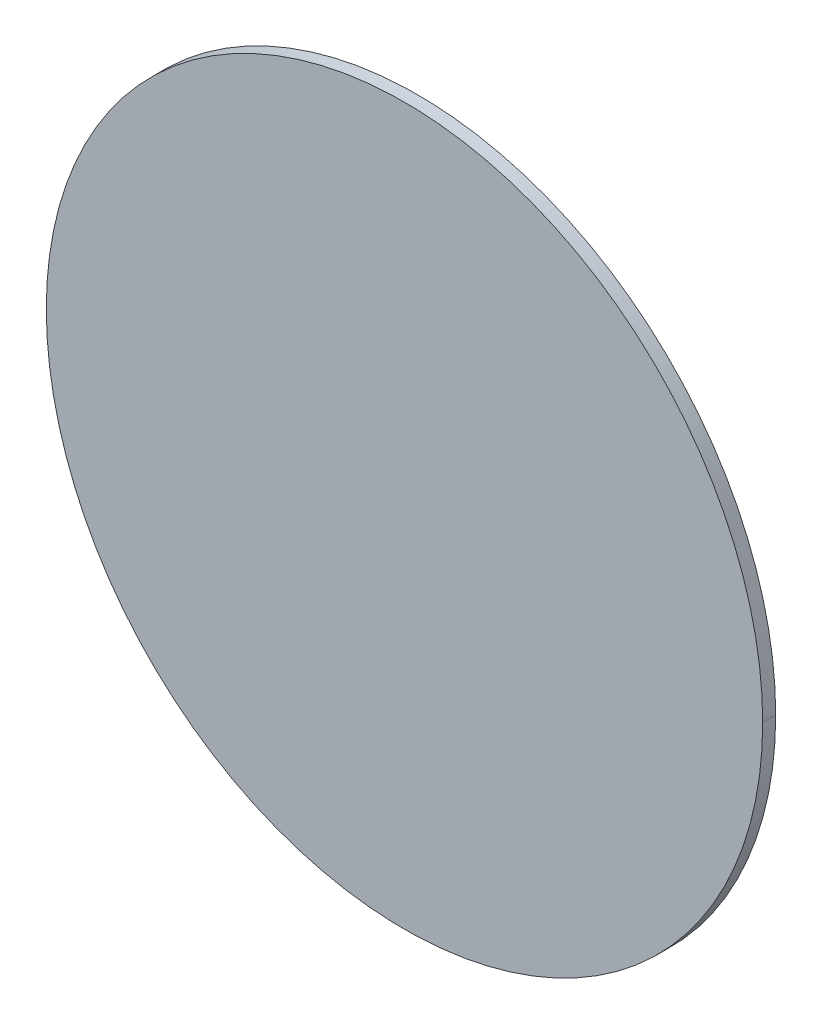
ISO-10303-21;
HEADER;
FILE_DESCRIPTION(('STEP AP214'),'2;1');
FILE_NAME('part.step','',(''),(''),'','','');
FILE_SCHEMA(('AUTOMOTIVE_DESIGN { 1 0 10303 214 1 1 1 1 }'));
ENDSEC;
DATA;
#1=APPLICATION_CONTEXT('core data for automotive mechanical design processes');
#2=APPLICATION_PROTOCOL_DEFINITION('international standard','automotive_design',2000,#1);
#3=PRODUCT_CONTEXT('',#1,'mechanical');
#4=PRODUCT('Part','Part','',(#3));
#5=PRODUCT_RELATED_PRODUCT_CATEGORY('part','',(#4));
#6=PRODUCT_DEFINITION_FORMATION('','',#4);
#7=PRODUCT_DEFINITION_CONTEXT('part definition',#1,'design');
#8=PRODUCT_DEFINITION('design','',#6,#7);
#9=PRODUCT_DEFINITION_SHAPE('','',#8);
#10=(LENGTH_UNIT() NAMED_UNIT(*) SI_UNIT(.MILLI.,.METRE.));
#11=(NAMED_UNIT(*) PLANE_ANGLE_UNIT() SI_UNIT($,.RADIAN.));
#12=(NAMED_UNIT(*) SI_UNIT($,.STERADIAN.) SOLID_ANGLE_UNIT());
#13=UNCERTAINTY_MEASURE_WITH_UNIT(LENGTH_MEASURE(1.E-05),#10,'distance_accuracy_value','');
#14=(GEOMETRIC_REPRESENTATION_CONTEXT(3) GLOBAL_UNCERTAINTY_ASSIGNED_CONTEXT((#13)) GLOBAL_UNIT_ASSIGNED_CONTEXT((#10,
#11,#12)) REPRESENTATION_CONTEXT('',''));
#15=CARTESIAN_POINT('',(0.,0.,0.));
#16=DIRECTION('',(0.,0.,1.));
#17=DIRECTION('',(1.,0.,0.));
#18=AXIS2_PLACEMENT_3D('',#15,#16,#17);
#19=CARTESIAN_POINT('',(8.157399902344,50.086996856221,1.1723000001));
#20=DIRECTION('',(0.,0.,1.));
#21=DIRECTION('',(1.,0.,0.));
#22=AXIS2_PLACEMENT_3D('',#19,#20,#21);
#23=PLANE('',#22);
#24=CARTESIAN_POINT('',(8.157399902344,50.086996856221,1.1723000001));
#25=DIRECTION('',(0.,0.,-1.));
#26=DIRECTION('',(1.,0.,0.));
#27=AXIS2_PLACEMENT_3D('',#24,#25,#26);
#28=CIRCLE('',#27,0.349999785909);
#29=CARTESIAN_POINT('',(8.507399688253,50.086996856221,1.1723000001));
#30=VERTEX_POINT('',#29);
#31=CARTESIAN_POINT('',(7.807400116435,50.086996856221,1.1723000001));
#32=VERTEX_POINT('',#31);
#33=EDGE_CURVE('E11',#30,#32,#28,.T.);
#34=ORIENTED_EDGE('',*,*,#33,.F.);
#35=CARTESIAN_POINT('',(8.157399902344,50.086996856221,1.1723000001));
#36=DIRECTION('',(0.,0.,-1.));
#37=DIRECTION('',(1.,0.,0.));
#38=AXIS2_PLACEMENT_3D('',#35,#36,#37);
#39=CIRCLE('',#38,0.349999785909);
#40=EDGE_CURVE('E64',#32,#30,#39,.T.);
#41=ORIENTED_EDGE('',*,*,#40,.F.);
#42=EDGE_LOOP('',(#34,#41));
#43=FACE_BOUND('',#42,.T.);
#44=ADVANCED_FACE('F17',(#43),#23,.T.);
#45=CARTESIAN_POINT('',(8.157399902344,50.086996856221,1.1596000001));
#46=DIRECTION('',(0.,0.,1.));
#47=DIRECTION('',(1.,0.,0.));
#48=AXIS2_PLACEMENT_3D('',#45,#46,#47);
#49=CYLINDRICAL_SURFACE('',#48,0.349999785909);
#50=DIRECTION('',(0.,0.,1.));
#51=VECTOR('',#50,1.);
#52=CARTESIAN_POINT('',(7.807400116435,50.086996856221,1.1596000001));
#53=LINE('',#52,#51);
#54=CARTESIAN_POINT('',(7.807400116435,50.086996856221,1.1596000001));
#55=VERTEX_POINT('',#54);
#56=EDGE_CURVE('E57',#55,#32,#53,.T.);
#57=ORIENTED_EDGE('',*,*,#56,.F.);
#58=CARTESIAN_POINT('',(8.157399902344,50.086996856221,1.1596000001));
#59=DIRECTION('',(0.,0.,1.));
#60=DIRECTION('',(1.,0.,0.));
#61=AXIS2_PLACEMENT_3D('',#58,#59,#60);
#62=CIRCLE('',#61,0.349999785909);
#63=CARTESIAN_POINT('',(8.507399688253,50.086996856221,1.1596000001));
#64=VERTEX_POINT('',#63);
#65=EDGE_CURVE('E27',#55,#64,#62,.T.);
#66=ORIENTED_EDGE('',*,*,#65,.T.);
#67=DIRECTION('',(0.,0.,1.));
#68=VECTOR('',#67,1.);
#69=CARTESIAN_POINT('',(8.507399688253,50.086996856221,1.1596000001));
#70=LINE('',#69,#68);
#71=EDGE_CURVE('E20',#64,#30,#70,.T.);
#72=ORIENTED_EDGE('',*,*,#71,.T.);
#73=ORIENTED_EDGE('',*,*,#33,.T.);
#74=EDGE_LOOP('',(#57,#66,#72,#73));
#75=FACE_BOUND('',#74,.T.);
#76=ADVANCED_FACE('F54',(#75),#49,.T.);
#77=CARTESIAN_POINT('',(8.157399902344,50.086996856221,1.1596000001));
#78=DIRECTION('',(0.,0.,1.));
#79=DIRECTION('',(1.,0.,0.));
#80=AXIS2_PLACEMENT_3D('',#77,#78,#79);
#81=PLANE('',#80);
#82=CARTESIAN_POINT('',(8.157399902344,50.086996856221,1.1596000001));
#83=DIRECTION('',(0.,0.,1.));
#84=DIRECTION('',(1.,0.,0.));
#85=AXIS2_PLACEMENT_3D('',#82,#83,#84);
#86=CIRCLE('',#85,0.349999785909);
#87=EDGE_CURVE('E63',#64,#55,#86,.T.);
#88=ORIENTED_EDGE('',*,*,#87,.F.);
#89=ORIENTED_EDGE('',*,*,#65,.F.);
#90=EDGE_LOOP('',(#88,#89));
#91=FACE_BOUND('',#90,.T.);
#92=ADVANCED_FACE('F66',(#91),#81,.F.);
#93=CARTESIAN_POINT('',(8.157399902344,50.086996856221,1.1596000001));
#94=DIRECTION('',(0.,0.,1.));
#95=DIRECTION('',(1.,0.,0.));
#96=AXIS2_PLACEMENT_3D('',#93,#94,#95);
#97=CYLINDRICAL_SURFACE('',#96,0.349999785909);
#98=ORIENTED_EDGE('',*,*,#87,.T.);
#99=ORIENTED_EDGE('',*,*,#56,.T.);
#100=ORIENTED_EDGE('',*,*,#40,.T.);
#101=ORIENTED_EDGE('',*,*,#71,.F.);
#102=EDGE_LOOP('',(#98,#99,#100,#101));
#103=FACE_BOUND('',#102,.T.);
#104=ADVANCED_FACE('F62',(#103),#97,.T.);
#105=CLOSED_SHELL('',(#44,#76,#92,#104));
#106=MANIFOLD_SOLID_BREP('B1',#105);
#107=ADVANCED_BREP_SHAPE_REPRESENTATION('',(#18,#106),#14);
#108=SHAPE_DEFINITION_REPRESENTATION(#9,#107);
ENDSEC;
END-ISO-10303-21;
